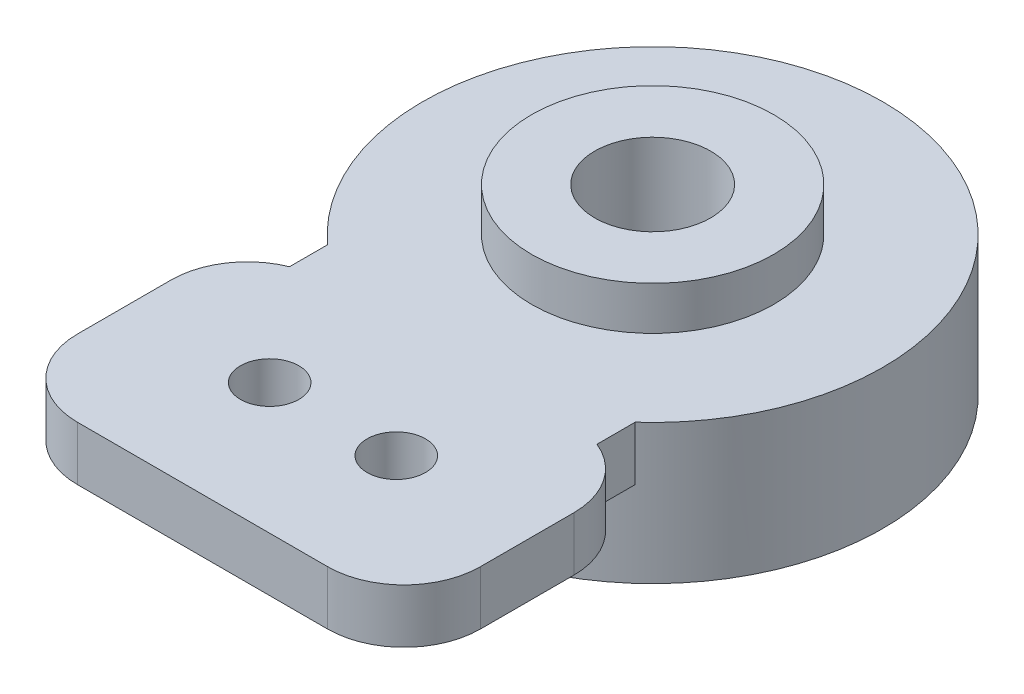
ISO-10303-21;
HEADER;
FILE_DESCRIPTION(('STEP AP214'),'2;1');
FILE_NAME('part.step','',(''),(''),'','','');
FILE_SCHEMA(('AUTOMOTIVE_DESIGN { 1 0 10303 214 1 1 1 1 }'));
ENDSEC;
DATA;
#1=APPLICATION_CONTEXT('core data for automotive mechanical design processes');
#2=APPLICATION_PROTOCOL_DEFINITION('international standard','automotive_design',2000,#1);
#3=PRODUCT_CONTEXT('',#1,'mechanical');
#4=PRODUCT('Part','Part','',(#3));
#5=PRODUCT_RELATED_PRODUCT_CATEGORY('part','',(#4));
#6=PRODUCT_DEFINITION_FORMATION('','',#4);
#7=PRODUCT_DEFINITION_CONTEXT('part definition',#1,'design');
#8=PRODUCT_DEFINITION('design','',#6,#7);
#9=PRODUCT_DEFINITION_SHAPE('','',#8);
#10=(LENGTH_UNIT() NAMED_UNIT(*) SI_UNIT(.MILLI.,.METRE.));
#11=(NAMED_UNIT(*) PLANE_ANGLE_UNIT() SI_UNIT($,.RADIAN.));
#12=(NAMED_UNIT(*) SI_UNIT($,.STERADIAN.) SOLID_ANGLE_UNIT());
#13=UNCERTAINTY_MEASURE_WITH_UNIT(LENGTH_MEASURE(1.E-05),#10,'distance_accuracy_value','');
#14=(GEOMETRIC_REPRESENTATION_CONTEXT(3) GLOBAL_UNCERTAINTY_ASSIGNED_CONTEXT((#13)) GLOBAL_UNIT_ASSIGNED_CONTEXT((#10,
#11,#12)) REPRESENTATION_CONTEXT('',''));
#15=CARTESIAN_POINT('',(0.,0.,0.));
#16=DIRECTION('',(0.,0.,1.));
#17=DIRECTION('',(1.,0.,0.));
#18=AXIS2_PLACEMENT_3D('',#15,#16,#17);
#19=CARTESIAN_POINT('',(6.55,2.83,14.6747039521318));
#20=DIRECTION('',(0.,-1.,0.));
#21=DIRECTION('',(0.,0.,-1.));
#22=AXIS2_PLACEMENT_3D('',#19,#20,#21);
#23=CYLINDRICAL_SURFACE('',#22,4.);
#24=CARTESIAN_POINT('',(6.55,0.,14.6747039521318));
#25=DIRECTION('',(0.,1.,0.));
#26=DIRECTION('',(0.,0.,-1.));
#27=AXIS2_PLACEMENT_3D('',#24,#25,#26);
#28=CIRCLE('',#27,4.);
#29=CARTESIAN_POINT('',(10.55,0.,14.6747039521318));
#30=VERTEX_POINT('',#29);
#31=CARTESIAN_POINT('',(8.05,0.,10.966604708584));
#32=VERTEX_POINT('',#31);
#33=EDGE_CURVE('E145',#30,#32,#28,.T.);
#34=ORIENTED_EDGE('',*,*,#33,.T.);
#35=DIRECTION('',(0.,-1.,0.));
#36=VECTOR('',#35,1.);
#37=CARTESIAN_POINT('',(8.05,2.83,10.966604708584));
#38=LINE('',#37,#36);
#39=CARTESIAN_POINT('',(8.05,2.83,10.966604708584));
#40=VERTEX_POINT('',#39);
#41=EDGE_CURVE('E44',#40,#32,#38,.T.);
#42=ORIENTED_EDGE('',*,*,#41,.F.);
#43=CARTESIAN_POINT('',(6.55,2.83,14.6747039521318));
#44=DIRECTION('',(0.,1.,0.));
#45=DIRECTION('',(0.,0.,-1.));
#46=AXIS2_PLACEMENT_3D('',#43,#44,#45);
#47=CIRCLE('',#46,4.);
#48=CARTESIAN_POINT('',(10.55,2.83,14.6747039521318));
#49=VERTEX_POINT('',#48);
#50=EDGE_CURVE('E163',#49,#40,#47,.T.);
#51=ORIENTED_EDGE('',*,*,#50,.F.);
#52=DIRECTION('',(0.,-1.,0.));
#53=VECTOR('',#52,1.);
#54=CARTESIAN_POINT('',(10.55,2.83,14.6747039521318));
#55=LINE('',#54,#53);
#56=EDGE_CURVE('E141',#49,#30,#55,.T.);
#57=ORIENTED_EDGE('',*,*,#56,.T.);
#58=EDGE_LOOP('',(#34,#42,#51,#57));
#59=FACE_BOUND('',#58,.T.);
#60=ADVANCED_FACE('F35',(#59),#23,.T.);
#61=CARTESIAN_POINT('',(8.05,2.83,8.96660470858396));
#62=DIRECTION('',(-1.,0.,0.));
#63=DIRECTION('',(0.,0.,1.));
#64=AXIS2_PLACEMENT_3D('',#61,#62,#63);
#65=PLANE('',#64);
#66=DIRECTION('',(0.,0.,-1.));
#67=VECTOR('',#66,1.);
#68=CARTESIAN_POINT('',(8.05,0.,8.96660470858396));
#69=LINE('',#68,#67);
#70=CARTESIAN_POINT('',(8.05,0.,8.96660470858396));
#71=VERTEX_POINT('',#70);
#72=EDGE_CURVE('E148',#32,#71,#69,.T.);
#73=ORIENTED_EDGE('',*,*,#72,.T.);
#74=DIRECTION('',(0.,-1.,0.));
#75=VECTOR('',#74,1.);
#76=CARTESIAN_POINT('',(8.05,2.83,8.96660470858396));
#77=LINE('',#76,#75);
#78=CARTESIAN_POINT('',(8.05,2.83,8.96660470858396));
#79=VERTEX_POINT('',#78);
#80=EDGE_CURVE('E179',#79,#71,#77,.T.);
#81=ORIENTED_EDGE('',*,*,#80,.F.);
#82=DIRECTION('',(0.,0.,-1.));
#83=VECTOR('',#82,1.);
#84=CARTESIAN_POINT('',(8.05,2.83,8.96660470858396));
#85=LINE('',#84,#83);
#86=EDGE_CURVE('E101',#40,#79,#85,.T.);
#87=ORIENTED_EDGE('',*,*,#86,.F.);
#88=ORIENTED_EDGE('',*,*,#41,.T.);
#89=EDGE_LOOP('',(#73,#81,#87,#88));
#90=FACE_BOUND('',#89,.T.);
#91=ADVANCED_FACE('F246',(#90),#65,.F.);
#92=CARTESIAN_POINT('',(0.,2.83,0.));
#93=DIRECTION('',(0.,-1.,0.));
#94=DIRECTION('',(0.,0.,-1.));
#95=AXIS2_PLACEMENT_3D('',#92,#93,#94);
#96=CYLINDRICAL_SURFACE('',#95,12.05);
#97=ORIENTED_EDGE('',*,*,#80,.T.);
#98=CARTESIAN_POINT('',(0.,0.,0.));
#99=DIRECTION('',(0.,-1.,0.));
#100=DIRECTION('',(0.,0.,-1.));
#101=AXIS2_PLACEMENT_3D('',#98,#99,#100);
#102=CIRCLE('',#101,12.05);
#103=CARTESIAN_POINT('',(-8.05,0.,8.96660470858395));
#104=VERTEX_POINT('',#103);
#105=EDGE_CURVE('E204',#71,#104,#102,.T.);
#106=ORIENTED_EDGE('',*,*,#105,.T.);
#107=DIRECTION('',(0.,-1.,0.));
#108=VECTOR('',#107,1.);
#109=CARTESIAN_POINT('',(-8.05,2.83,8.96660470858395));
#110=LINE('',#109,#108);
#111=CARTESIAN_POINT('',(-8.05,2.83,8.96660470858395));
#112=VERTEX_POINT('',#111);
#113=EDGE_CURVE('E176',#112,#104,#110,.T.);
#114=ORIENTED_EDGE('',*,*,#113,.F.);
#115=CARTESIAN_POINT('',(0.,2.83,0.));
#116=DIRECTION('',(0.,1.,0.));
#117=DIRECTION('',(0.,0.,1.));
#118=AXIS2_PLACEMENT_3D('',#115,#116,#117);
#119=CIRCLE('',#118,12.05);
#120=EDGE_CURVE('E210',#79,#112,#119,.T.);
#121=ORIENTED_EDGE('',*,*,#120,.F.);
#122=EDGE_LOOP('',(#97,#106,#114,#121));
#123=FACE_BOUND('',#122,.T.);
#124=CARTESIAN_POINT('',(0.,-4.48,0.));
#125=DIRECTION('',(0.,-1.,0.));
#126=DIRECTION('',(0.,0.,-1.));
#127=AXIS2_PLACEMENT_3D('',#124,#125,#126);
#128=CIRCLE('',#127,12.05);
#129=CARTESIAN_POINT('',(0.,-4.48,-12.05));
#130=VERTEX_POINT('',#129);
#131=EDGE_CURVE('E149',#130,#130,#128,.T.);
#132=ORIENTED_EDGE('',*,*,#131,.F.);
#133=EDGE_LOOP('',(#132));
#134=FACE_BOUND('',#133,.T.);
#135=ADVANCED_FACE('F250',(#123,#134),#96,.T.);
#136=CARTESIAN_POINT('',(-8.05,2.83,8.96660470858395));
#137=DIRECTION('',(1.,0.,0.));
#138=DIRECTION('',(0.,0.,-1.));
#139=AXIS2_PLACEMENT_3D('',#136,#137,#138);
#140=PLANE('',#139);
#141=DIRECTION('',(0.,0.,1.));
#142=VECTOR('',#141,1.);
#143=CARTESIAN_POINT('',(-8.05,0.,8.96660470858395));
#144=LINE('',#143,#142);
#145=CARTESIAN_POINT('',(-8.05,0.,10.966604708584));
#146=VERTEX_POINT('',#145);
#147=EDGE_CURVE('E152',#104,#146,#144,.T.);
#148=ORIENTED_EDGE('',*,*,#147,.T.);
#149=DIRECTION('',(0.,-1.,0.));
#150=VECTOR('',#149,1.);
#151=CARTESIAN_POINT('',(-8.05,2.83,10.966604708584));
#152=LINE('',#151,#150);
#153=CARTESIAN_POINT('',(-8.05,2.83,10.966604708584));
#154=VERTEX_POINT('',#153);
#155=EDGE_CURVE('E173',#154,#146,#152,.T.);
#156=ORIENTED_EDGE('',*,*,#155,.F.);
#157=DIRECTION('',(0.,0.,1.));
#158=VECTOR('',#157,1.);
#159=CARTESIAN_POINT('',(-8.05,2.83,8.96660470858395));
#160=LINE('',#159,#158);
#161=EDGE_CURVE('E212',#112,#154,#160,.T.);
#162=ORIENTED_EDGE('',*,*,#161,.F.);
#163=ORIENTED_EDGE('',*,*,#113,.T.);
#164=EDGE_LOOP('',(#148,#156,#162,#163));
#165=FACE_BOUND('',#164,.T.);
#166=ADVANCED_FACE('F254',(#165),#140,.F.);
#167=CARTESIAN_POINT('',(-6.55,2.83,14.6747039521318));
#168=DIRECTION('',(0.,-1.,0.));
#169=DIRECTION('',(0.,0.,-1.));
#170=AXIS2_PLACEMENT_3D('',#167,#168,#169);
#171=CYLINDRICAL_SURFACE('',#170,4.);
#172=CARTESIAN_POINT('',(-6.55,0.,14.6747039521318));
#173=DIRECTION('',(0.,1.,0.));
#174=DIRECTION('',(0.,0.,-1.));
#175=AXIS2_PLACEMENT_3D('',#172,#173,#174);
#176=CIRCLE('',#175,4.);
#177=CARTESIAN_POINT('',(-10.55,0.,14.6747039521318));
#178=VERTEX_POINT('',#177);
#179=EDGE_CURVE('E154',#146,#178,#176,.T.);
#180=ORIENTED_EDGE('',*,*,#179,.T.);
#181=DIRECTION('',(0.,-1.,0.));
#182=VECTOR('',#181,1.);
#183=CARTESIAN_POINT('',(-10.55,2.83,14.6747039521318));
#184=LINE('',#183,#182);
#185=CARTESIAN_POINT('',(-10.55,2.83,14.6747039521318));
#186=VERTEX_POINT('',#185);
#187=EDGE_CURVE('E170',#186,#178,#184,.T.);
#188=ORIENTED_EDGE('',*,*,#187,.F.);
#189=CARTESIAN_POINT('',(-6.55,2.83,14.6747039521318));
#190=DIRECTION('',(0.,1.,0.));
#191=DIRECTION('',(0.,0.,-1.));
#192=AXIS2_PLACEMENT_3D('',#189,#190,#191);
#193=CIRCLE('',#192,4.);
#194=EDGE_CURVE('E214',#154,#186,#193,.T.);
#195=ORIENTED_EDGE('',*,*,#194,.F.);
#196=ORIENTED_EDGE('',*,*,#155,.T.);
#197=EDGE_LOOP('',(#180,#188,#195,#196));
#198=FACE_BOUND('',#197,.T.);
#199=ADVANCED_FACE('F260',(#198),#171,.T.);
#200=CARTESIAN_POINT('',(-10.55,2.83,19.57));
#201=DIRECTION('',(1.,0.,0.));
#202=DIRECTION('',(0.,0.,-1.));
#203=AXIS2_PLACEMENT_3D('',#200,#201,#202);
#204=PLANE('',#203);
#205=DIRECTION('',(0.,0.,1.));
#206=VECTOR('',#205,1.);
#207=CARTESIAN_POINT('',(-10.55,0.,19.57));
#208=LINE('',#207,#206);
#209=CARTESIAN_POINT('',(-10.55,0.,19.57));
#210=VERTEX_POINT('',#209);
#211=EDGE_CURVE('E156',#178,#210,#208,.T.);
#212=ORIENTED_EDGE('',*,*,#211,.T.);
#213=DIRECTION('',(0.,-1.,0.));
#214=VECTOR('',#213,1.);
#215=CARTESIAN_POINT('',(-10.55,2.83,19.57));
#216=LINE('',#215,#214);
#217=CARTESIAN_POINT('',(-10.55,2.83,19.57));
#218=VERTEX_POINT('',#217);
#219=EDGE_CURVE('E167',#218,#210,#216,.T.);
#220=ORIENTED_EDGE('',*,*,#219,.F.);
#221=DIRECTION('',(0.,0.,1.));
#222=VECTOR('',#221,1.);
#223=CARTESIAN_POINT('',(-10.55,2.83,19.57));
#224=LINE('',#223,#222);
#225=EDGE_CURVE('E216',#186,#218,#224,.T.);
#226=ORIENTED_EDGE('',*,*,#225,.F.);
#227=ORIENTED_EDGE('',*,*,#187,.T.);
#228=EDGE_LOOP('',(#212,#220,#226,#227));
#229=FACE_BOUND('',#228,.T.);
#230=ADVANCED_FACE('F222',(#229),#204,.F.);
#231=CARTESIAN_POINT('',(-6.55,2.83,19.57));
#232=DIRECTION('',(0.,-1.,0.));
#233=DIRECTION('',(0.,0.,-1.));
#234=AXIS2_PLACEMENT_3D('',#231,#232,#233);
#235=CYLINDRICAL_SURFACE('',#234,4.);
#236=CARTESIAN_POINT('',(-6.55,0.,19.57));
#237=DIRECTION('',(0.,1.,0.));
#238=DIRECTION('',(0.,0.,-1.));
#239=AXIS2_PLACEMENT_3D('',#236,#237,#238);
#240=CIRCLE('',#239,4.);
#241=CARTESIAN_POINT('',(-6.55,0.,23.57));
#242=VERTEX_POINT('',#241);
#243=EDGE_CURVE('E158',#210,#242,#240,.T.);
#244=ORIENTED_EDGE('',*,*,#243,.T.);
#245=DIRECTION('',(0.,-1.,0.));
#246=VECTOR('',#245,1.);
#247=CARTESIAN_POINT('',(-6.55,2.83,23.57));
#248=LINE('',#247,#246);
#249=CARTESIAN_POINT('',(-6.55,2.83,23.57));
#250=VERTEX_POINT('',#249);
#251=EDGE_CURVE('E136',#250,#242,#248,.T.);
#252=ORIENTED_EDGE('',*,*,#251,.F.);
#253=CARTESIAN_POINT('',(-6.55,2.83,19.57));
#254=DIRECTION('',(0.,1.,0.));
#255=DIRECTION('',(0.,0.,-1.));
#256=AXIS2_PLACEMENT_3D('',#253,#254,#255);
#257=CIRCLE('',#256,4.);
#258=EDGE_CURVE('E127',#218,#250,#257,.T.);
#259=ORIENTED_EDGE('',*,*,#258,.F.);
#260=ORIENTED_EDGE('',*,*,#219,.T.);
#261=EDGE_LOOP('',(#244,#252,#259,#260));
#262=FACE_BOUND('',#261,.T.);
#263=ADVANCED_FACE('F226',(#262),#235,.T.);
#264=CARTESIAN_POINT('',(-6.55,2.83,23.57));
#265=DIRECTION('',(0.,0.,-1.));
#266=DIRECTION('',(-1.,0.,0.));
#267=AXIS2_PLACEMENT_3D('',#264,#265,#266);
#268=PLANE('',#267);
#269=DIRECTION('',(1.,0.,0.));
#270=VECTOR('',#269,1.);
#271=CARTESIAN_POINT('',(-6.55,0.,23.57));
#272=LINE('',#271,#270);
#273=CARTESIAN_POINT('',(6.55,0.,23.57));
#274=VERTEX_POINT('',#273);
#275=EDGE_CURVE('E135',#242,#274,#272,.T.);
#276=ORIENTED_EDGE('',*,*,#275,.T.);
#277=DIRECTION('',(0.,-1.,0.));
#278=VECTOR('',#277,1.);
#279=CARTESIAN_POINT('',(6.55,2.83,23.57));
#280=LINE('',#279,#278);
#281=CARTESIAN_POINT('',(6.55,2.83,23.57));
#282=VERTEX_POINT('',#281);
#283=EDGE_CURVE('E132',#282,#274,#280,.T.);
#284=ORIENTED_EDGE('',*,*,#283,.F.);
#285=DIRECTION('',(1.,0.,0.));
#286=VECTOR('',#285,1.);
#287=CARTESIAN_POINT('',(-6.55,2.83,23.57));
#288=LINE('',#287,#286);
#289=EDGE_CURVE('E121',#250,#282,#288,.T.);
#290=ORIENTED_EDGE('',*,*,#289,.F.);
#291=ORIENTED_EDGE('',*,*,#251,.T.);
#292=EDGE_LOOP('',(#276,#284,#290,#291));
#293=FACE_BOUND('',#292,.T.);
#294=ADVANCED_FACE('F133',(#293),#268,.F.);
#295=CARTESIAN_POINT('',(6.55,2.83,19.57));
#296=DIRECTION('',(0.,-1.,0.));
#297=DIRECTION('',(0.,0.,-1.));
#298=AXIS2_PLACEMENT_3D('',#295,#296,#297);
#299=CYLINDRICAL_SURFACE('',#298,4.);
#300=CARTESIAN_POINT('',(6.55,0.,19.57));
#301=DIRECTION('',(0.,1.,0.));
#302=DIRECTION('',(0.,0.,1.));
#303=AXIS2_PLACEMENT_3D('',#300,#301,#302);
#304=CIRCLE('',#303,4.);
#305=CARTESIAN_POINT('',(10.55,0.,19.57));
#306=VERTEX_POINT('',#305);
#307=EDGE_CURVE('E86',#274,#306,#304,.T.);
#308=ORIENTED_EDGE('',*,*,#307,.T.);
#309=DIRECTION('',(0.,-1.,0.));
#310=VECTOR('',#309,1.);
#311=CARTESIAN_POINT('',(10.55,2.83,19.57));
#312=LINE('',#311,#310);
#313=CARTESIAN_POINT('',(10.55,2.83,19.57));
#314=VERTEX_POINT('',#313);
#315=EDGE_CURVE('E137',#314,#306,#312,.T.);
#316=ORIENTED_EDGE('',*,*,#315,.F.);
#317=CARTESIAN_POINT('',(6.55,2.83,19.57));
#318=DIRECTION('',(0.,1.,0.));
#319=DIRECTION('',(0.,0.,1.));
#320=AXIS2_PLACEMENT_3D('',#317,#318,#319);
#321=CIRCLE('',#320,4.);
#322=EDGE_CURVE('E125',#282,#314,#321,.T.);
#323=ORIENTED_EDGE('',*,*,#322,.F.);
#324=ORIENTED_EDGE('',*,*,#283,.T.);
#325=EDGE_LOOP('',(#308,#316,#323,#324));
#326=FACE_BOUND('',#325,.T.);
#327=ADVANCED_FACE('F139',(#326),#299,.T.);
#328=CARTESIAN_POINT('',(10.55,2.83,19.57));
#329=DIRECTION('',(-1.,0.,0.));
#330=DIRECTION('',(0.,0.,1.));
#331=AXIS2_PLACEMENT_3D('',#328,#329,#330);
#332=PLANE('',#331);
#333=DIRECTION('',(0.,0.,-1.));
#334=VECTOR('',#333,1.);
#335=CARTESIAN_POINT('',(10.55,0.,19.57));
#336=LINE('',#335,#334);
#337=EDGE_CURVE('E92',#306,#30,#336,.T.);
#338=ORIENTED_EDGE('',*,*,#337,.T.);
#339=ORIENTED_EDGE('',*,*,#56,.F.);
#340=DIRECTION('',(0.,0.,-1.));
#341=VECTOR('',#340,1.);
#342=CARTESIAN_POINT('',(10.55,2.83,19.57));
#343=LINE('',#342,#341);
#344=EDGE_CURVE('E53',#314,#49,#343,.T.);
#345=ORIENTED_EDGE('',*,*,#344,.F.);
#346=ORIENTED_EDGE('',*,*,#315,.T.);
#347=EDGE_LOOP('',(#338,#339,#345,#346));
#348=FACE_BOUND('',#347,.T.);
#349=ADVANCED_FACE('F234',(#348),#332,.F.);
#350=CARTESIAN_POINT('',(6.55,2.83,14.6747039521318));
#351=DIRECTION('',(0.,-1.,0.));
#352=DIRECTION('',(0.,0.,-1.));
#353=AXIS2_PLACEMENT_3D('',#350,#351,#352);
#354=PLANE('',#353);
#355=CARTESIAN_POINT('',(3.315,2.83,16.74));
#356=DIRECTION('',(0.,1.,0.));
#357=DIRECTION('',(0.,0.,1.));
#358=AXIS2_PLACEMENT_3D('',#355,#356,#357);
#359=CIRCLE('',#358,1.53);
#360=CARTESIAN_POINT('',(3.315,2.83,18.27));
#361=VERTEX_POINT('',#360);
#362=EDGE_CURVE('E196',#361,#361,#359,.T.);
#363=ORIENTED_EDGE('',*,*,#362,.F.);
#364=EDGE_LOOP('',(#363));
#365=FACE_BOUND('',#364,.T.);
#366=CARTESIAN_POINT('',(-3.315,2.83,16.74));
#367=DIRECTION('',(0.,1.,0.));
#368=DIRECTION('',(0.,0.,1.));
#369=AXIS2_PLACEMENT_3D('',#366,#367,#368);
#370=CIRCLE('',#369,1.53);
#371=CARTESIAN_POINT('',(-3.315,2.83,18.27));
#372=VERTEX_POINT('',#371);
#373=EDGE_CURVE('E185',#372,#372,#370,.T.);
#374=ORIENTED_EDGE('',*,*,#373,.F.);
#375=EDGE_LOOP('',(#374));
#376=FACE_BOUND('',#375,.T.);
#377=CARTESIAN_POINT('',(0.,2.83,0.));
#378=DIRECTION('',(0.,-1.,0.));
#379=DIRECTION('',(0.,0.,-1.));
#380=AXIS2_PLACEMENT_3D('',#377,#378,#379);
#381=CIRCLE('',#380,6.34);
#382=CARTESIAN_POINT('',(0.,2.83,-6.34));
#383=VERTEX_POINT('',#382);
#384=EDGE_CURVE('E11',#383,#383,#381,.F.);
#385=ORIENTED_EDGE('',*,*,#384,.F.);
#386=EDGE_LOOP('',(#385));
#387=FACE_BOUND('',#386,.T.);
#388=ORIENTED_EDGE('',*,*,#50,.T.);
#389=ORIENTED_EDGE('',*,*,#86,.T.);
#390=ORIENTED_EDGE('',*,*,#120,.T.);
#391=ORIENTED_EDGE('',*,*,#161,.T.);
#392=ORIENTED_EDGE('',*,*,#194,.T.);
#393=ORIENTED_EDGE('',*,*,#225,.T.);
#394=ORIENTED_EDGE('',*,*,#258,.T.);
#395=ORIENTED_EDGE('',*,*,#289,.T.);
#396=ORIENTED_EDGE('',*,*,#322,.T.);
#397=ORIENTED_EDGE('',*,*,#344,.T.);
#398=EDGE_LOOP('',(#388,#389,#390,#391,#392,#393,#394,#395,#396,#397));
#399=FACE_BOUND('',#398,.T.);
#400=ADVANCED_FACE('F123',(#365,#376,#387,#399),#354,.F.);
#401=CARTESIAN_POINT('',(6.55,0.,14.6747039521318));
#402=DIRECTION('',(0.,-1.,0.));
#403=DIRECTION('',(0.,0.,-1.));
#404=AXIS2_PLACEMENT_3D('',#401,#402,#403);
#405=PLANE('',#404);
#406=CARTESIAN_POINT('',(3.315,0.,16.74));
#407=DIRECTION('',(0.,-1.,0.));
#408=DIRECTION('',(0.,0.,-1.));
#409=AXIS2_PLACEMENT_3D('',#406,#407,#408);
#410=CIRCLE('',#409,1.53);
#411=CARTESIAN_POINT('',(3.315,0.,18.27));
#412=VERTEX_POINT('',#411);
#413=EDGE_CURVE('E38',#412,#412,#410,.T.);
#414=ORIENTED_EDGE('',*,*,#413,.F.);
#415=EDGE_LOOP('',(#414));
#416=FACE_BOUND('',#415,.T.);
#417=CARTESIAN_POINT('',(-3.315,0.,16.74));
#418=DIRECTION('',(0.,-1.,0.));
#419=DIRECTION('',(0.,0.,-1.));
#420=AXIS2_PLACEMENT_3D('',#417,#418,#419);
#421=CIRCLE('',#420,1.53);
#422=CARTESIAN_POINT('',(-3.315,0.,18.27));
#423=VERTEX_POINT('',#422);
#424=EDGE_CURVE('E182',#423,#423,#421,.T.);
#425=ORIENTED_EDGE('',*,*,#424,.F.);
#426=EDGE_LOOP('',(#425));
#427=FACE_BOUND('',#426,.T.);
#428=ORIENTED_EDGE('',*,*,#105,.F.);
#429=ORIENTED_EDGE('',*,*,#72,.F.);
#430=ORIENTED_EDGE('',*,*,#33,.F.);
#431=ORIENTED_EDGE('',*,*,#337,.F.);
#432=ORIENTED_EDGE('',*,*,#307,.F.);
#433=ORIENTED_EDGE('',*,*,#275,.F.);
#434=ORIENTED_EDGE('',*,*,#243,.F.);
#435=ORIENTED_EDGE('',*,*,#211,.F.);
#436=ORIENTED_EDGE('',*,*,#179,.F.);
#437=ORIENTED_EDGE('',*,*,#147,.F.);
#438=EDGE_LOOP('',(#428,#429,#430,#431,#432,#433,#434,#435,#436,#437));
#439=FACE_BOUND('',#438,.T.);
#440=ADVANCED_FACE('F229',(#416,#427,#439),#405,.T.);
#441=CARTESIAN_POINT('',(0.,-4.48,0.));
#442=DIRECTION('',(0.,-1.,0.));
#443=DIRECTION('',(0.,0.,-1.));
#444=AXIS2_PLACEMENT_3D('',#441,#442,#443);
#445=PLANE('',#444);
#446=CARTESIAN_POINT('',(0.,-4.48,0.));
#447=DIRECTION('',(0.,1.,0.));
#448=DIRECTION('',(0.,0.,1.));
#449=AXIS2_PLACEMENT_3D('',#446,#447,#448);
#450=CIRCLE('',#449,3.035);
#451=CARTESIAN_POINT('',(0.,-4.48,3.035));
#452=VERTEX_POINT('',#451);
#453=EDGE_CURVE('E189',#452,#452,#450,.T.);
#454=ORIENTED_EDGE('',*,*,#453,.T.);
#455=EDGE_LOOP('',(#454));
#456=FACE_BOUND('',#455,.T.);
#457=ORIENTED_EDGE('',*,*,#131,.T.);
#458=EDGE_LOOP('',(#457));
#459=FACE_BOUND('',#458,.T.);
#460=ADVANCED_FACE('F315',(#456,#459),#445,.T.);
#461=CARTESIAN_POINT('',(0.,5.1,0.));
#462=DIRECTION('',(0.,-1.,0.));
#463=DIRECTION('',(0.,0.,-1.));
#464=AXIS2_PLACEMENT_3D('',#461,#462,#463);
#465=CYLINDRICAL_SURFACE('',#464,6.34);
#466=CARTESIAN_POINT('',(0.,5.1,0.));
#467=DIRECTION('',(0.,1.,0.));
#468=DIRECTION('',(0.,0.,1.));
#469=AXIS2_PLACEMENT_3D('',#466,#467,#468);
#470=CIRCLE('',#469,6.34);
#471=CARTESIAN_POINT('',(0.,5.1,6.34));
#472=VERTEX_POINT('',#471);
#473=EDGE_CURVE('E200',#472,#472,#470,.T.);
#474=ORIENTED_EDGE('',*,*,#473,.F.);
#475=EDGE_LOOP('',(#474));
#476=FACE_BOUND('',#475,.T.);
#477=ORIENTED_EDGE('',*,*,#384,.T.);
#478=EDGE_LOOP('',(#477));
#479=FACE_BOUND('',#478,.T.);
#480=ADVANCED_FACE('F309',(#476,#479),#465,.T.);
#481=CARTESIAN_POINT('',(0.,5.1,0.));
#482=DIRECTION('',(0.,1.,0.));
#483=DIRECTION('',(0.,0.,1.));
#484=AXIS2_PLACEMENT_3D('',#481,#482,#483);
#485=PLANE('',#484);
#486=CARTESIAN_POINT('',(0.,5.1,0.));
#487=DIRECTION('',(0.,1.,0.));
#488=DIRECTION('',(0.,0.,1.));
#489=AXIS2_PLACEMENT_3D('',#486,#487,#488);
#490=CIRCLE('',#489,3.035);
#491=CARTESIAN_POINT('',(0.,5.1,3.035));
#492=VERTEX_POINT('',#491);
#493=EDGE_CURVE('E184',#492,#492,#490,.T.);
#494=ORIENTED_EDGE('',*,*,#493,.F.);
#495=EDGE_LOOP('',(#494));
#496=FACE_BOUND('',#495,.T.);
#497=ORIENTED_EDGE('',*,*,#473,.T.);
#498=EDGE_LOOP('',(#497));
#499=FACE_BOUND('',#498,.T.);
#500=ADVANCED_FACE('F314',(#496,#499),#485,.T.);
#501=CARTESIAN_POINT('',(0.,-4.48,0.));
#502=DIRECTION('',(0.,1.,0.));
#503=DIRECTION('',(0.,0.,1.));
#504=AXIS2_PLACEMENT_3D('',#501,#502,#503);
#505=CYLINDRICAL_SURFACE('',#504,3.035);
#506=ORIENTED_EDGE('',*,*,#453,.F.);
#507=EDGE_LOOP('',(#506));
#508=FACE_BOUND('',#507,.T.);
#509=ORIENTED_EDGE('',*,*,#493,.T.);
#510=EDGE_LOOP('',(#509));
#511=FACE_BOUND('',#510,.T.);
#512=ADVANCED_FACE('F334',(#508,#511),#505,.F.);
#513=CARTESIAN_POINT('',(-3.315,-4.48,16.74));
#514=DIRECTION('',(0.,1.,0.));
#515=DIRECTION('',(0.,0.,1.));
#516=AXIS2_PLACEMENT_3D('',#513,#514,#515);
#517=CYLINDRICAL_SURFACE('',#516,1.53);
#518=CARTESIAN_POINT('',(-3.315,0.,18.27));
#519=CARTESIAN_POINT('',(-3.315,0.0294791666666676,18.27));
#520=CARTESIAN_POINT('',(-3.315,0.0589583333333342,18.27));
#521=CARTESIAN_POINT('',(-3.315,0.117916666666668,18.27));
#522=CARTESIAN_POINT('',(-3.315,0.147395833333334,18.27));
#523=CARTESIAN_POINT('',(-3.315,0.206354166666667,18.27));
#524=CARTESIAN_POINT('',(-3.315,0.235833333333334,18.27));
#525=CARTESIAN_POINT('',(-3.315,0.294791666666667,18.27));
#526=CARTESIAN_POINT('',(-3.315,0.324270833333334,18.27));
#527=CARTESIAN_POINT('',(-3.315,0.383229166666667,18.27));
#528=CARTESIAN_POINT('',(-3.315,0.412708333333334,18.27));
#529=CARTESIAN_POINT('',(-3.315,0.471666666666667,18.27));
#530=CARTESIAN_POINT('',(-3.315,0.501145833333334,18.27));
#531=CARTESIAN_POINT('',(-3.315,0.560104166666667,18.27));
#532=CARTESIAN_POINT('',(-3.315,0.589583333333334,18.27));
#533=CARTESIAN_POINT('',(-3.315,0.648541666666667,18.27));
#534=CARTESIAN_POINT('',(-3.315,0.678020833333334,18.27));
#535=CARTESIAN_POINT('',(-3.315,0.736979166666667,18.27));
#536=CARTESIAN_POINT('',(-3.315,0.766458333333334,18.27));
#537=CARTESIAN_POINT('',(-3.315,0.825416666666667,18.27));
#538=CARTESIAN_POINT('',(-3.315,0.854895833333334,18.27));
#539=CARTESIAN_POINT('',(-3.315,0.913854166666667,18.27));
#540=CARTESIAN_POINT('',(-3.315,0.943333333333334,18.27));
#541=CARTESIAN_POINT('',(-3.315,1.00229166666667,18.27));
#542=CARTESIAN_POINT('',(-3.315,1.03177083333333,18.27));
#543=CARTESIAN_POINT('',(-3.315,1.09072916666667,18.27));
#544=CARTESIAN_POINT('',(-3.315,1.12020833333333,18.27));
#545=CARTESIAN_POINT('',(-3.315,1.17916666666667,18.27));
#546=CARTESIAN_POINT('',(-3.315,1.20864583333333,18.27));
#547=CARTESIAN_POINT('',(-3.315,1.26760416666667,18.27));
#548=CARTESIAN_POINT('',(-3.315,1.29708333333333,18.27));
#549=CARTESIAN_POINT('',(-3.315,1.35604166666667,18.27));
#550=CARTESIAN_POINT('',(-3.315,1.38552083333333,18.27));
#551=CARTESIAN_POINT('',(-3.315,1.44447916666667,18.27));
#552=CARTESIAN_POINT('',(-3.315,1.47395833333333,18.27));
#553=CARTESIAN_POINT('',(-3.315,1.53291666666667,18.27));
#554=CARTESIAN_POINT('',(-3.315,1.56239583333333,18.27));
#555=CARTESIAN_POINT('',(-3.315,1.62135416666667,18.27));
#556=CARTESIAN_POINT('',(-3.315,1.65083333333333,18.27));
#557=CARTESIAN_POINT('',(-3.315,1.70979166666667,18.27));
#558=CARTESIAN_POINT('',(-3.315,1.73927083333333,18.27));
#559=CARTESIAN_POINT('',(-3.315,1.79822916666667,18.27));
#560=CARTESIAN_POINT('',(-3.315,1.82770833333333,18.27));
#561=CARTESIAN_POINT('',(-3.315,1.88666666666667,18.27));
#562=CARTESIAN_POINT('',(-3.315,1.91614583333333,18.27));
#563=CARTESIAN_POINT('',(-3.315,1.97510416666667,18.27));
#564=CARTESIAN_POINT('',(-3.315,2.00458333333333,18.27));
#565=CARTESIAN_POINT('',(-3.315,2.06354166666667,18.27));
#566=CARTESIAN_POINT('',(-3.315,2.09302083333333,18.27));
#567=CARTESIAN_POINT('',(-3.315,2.15197916666667,18.27));
#568=CARTESIAN_POINT('',(-3.315,2.18145833333333,18.27));
#569=CARTESIAN_POINT('',(-3.315,2.24041666666667,18.27));
#570=CARTESIAN_POINT('',(-3.315,2.26989583333333,18.27));
#571=CARTESIAN_POINT('',(-3.315,2.32885416666667,18.27));
#572=CARTESIAN_POINT('',(-3.315,2.35833333333333,18.27));
#573=CARTESIAN_POINT('',(-3.315,2.41729166666667,18.27));
#574=CARTESIAN_POINT('',(-3.315,2.44677083333333,18.27));
#575=CARTESIAN_POINT('',(-3.315,2.50572916666667,18.27));
#576=CARTESIAN_POINT('',(-3.315,2.53520833333333,18.27));
#577=CARTESIAN_POINT('',(-3.315,2.59416666666667,18.27));
#578=CARTESIAN_POINT('',(-3.315,2.62364583333333,18.27));
#579=CARTESIAN_POINT('',(-3.315,2.68260416666667,18.27));
#580=CARTESIAN_POINT('',(-3.315,2.71208333333333,18.27));
#581=CARTESIAN_POINT('',(-3.315,2.77104166666667,18.27));
#582=CARTESIAN_POINT('',(-3.315,2.80052083333333,18.27));
#583=CARTESIAN_POINT('',(-3.315,2.83,18.27));
#584=B_SPLINE_CURVE_WITH_KNOTS('',3,(#518,#519,#520,#521,#522,#523,#524,#525,#526,#527,#528,
#529,#530,#531,#532,#533,#534,#535,#536,#537,#538,#539,#540,#541,#542,#543,#544,#545,#546,#547,
#548,#549,#550,#551,#552,#553,#554,#555,#556,#557,#558,#559,#560,#561,#562,#563,#564,#565,#566,
#567,#568,#569,#570,#571,#572,#573,#574,#575,#576,#577,#578,#579,#580,#581,#582,#583),
.UNSPECIFIED.,.F.,.F.,(4,2,2,2,2,2,2,2,2,2,2,2,2,2,2,2,2,2,2,2,2,2,2,2,2,2,2,2,2,2,2,2,4),(0.,
0.0884375,0.176875,0.2653125,0.35375,0.4421875,0.530625,0.6190625,0.7075,0.7959375,0.884375,
0.9728125,1.06125,1.1496875,1.238125,1.3265625,1.415,1.5034375,1.591875,1.6803125,1.76875,
1.8571875,1.945625,2.0340625,2.1225,2.2109375,2.299375,2.3878125,2.47625,2.5646875,2.653125,
2.7415625,2.83),.UNSPECIFIED.);
#585=EDGE_CURVE('BSEAM344',#423,#372,#584,.T.);
#586=ORIENTED_EDGE('',*,*,#424,.T.);
#587=ORIENTED_EDGE('',*,*,#373,.T.);
#588=ORIENTED_EDGE('',*,*,#585,.T.);
#589=ORIENTED_EDGE('',*,*,#585,.F.);
#590=EDGE_LOOP('',(#586,#588,#587,#589));
#591=FACE_BOUND('',#590,.T.);
#592=ADVANCED_FACE('F344',(#591),#517,.F.);
#593=CARTESIAN_POINT('',(3.315,-4.48,16.74));
#594=DIRECTION('',(0.,1.,0.));
#595=DIRECTION('',(0.,0.,1.));
#596=AXIS2_PLACEMENT_3D('',#593,#594,#595);
#597=CYLINDRICAL_SURFACE('',#596,1.53);
#598=CARTESIAN_POINT('',(3.315,0.,18.27));
#599=CARTESIAN_POINT('',(3.315,0.0294791666666676,18.27));
#600=CARTESIAN_POINT('',(3.315,0.0589583333333342,18.27));
#601=CARTESIAN_POINT('',(3.315,0.117916666666668,18.27));
#602=CARTESIAN_POINT('',(3.315,0.147395833333334,18.27));
#603=CARTESIAN_POINT('',(3.315,0.206354166666667,18.27));
#604=CARTESIAN_POINT('',(3.315,0.235833333333334,18.27));
#605=CARTESIAN_POINT('',(3.315,0.294791666666667,18.27));
#606=CARTESIAN_POINT('',(3.315,0.324270833333334,18.27));
#607=CARTESIAN_POINT('',(3.315,0.383229166666667,18.27));
#608=CARTESIAN_POINT('',(3.315,0.412708333333334,18.27));
#609=CARTESIAN_POINT('',(3.315,0.471666666666667,18.27));
#610=CARTESIAN_POINT('',(3.315,0.501145833333334,18.27));
#611=CARTESIAN_POINT('',(3.315,0.560104166666667,18.27));
#612=CARTESIAN_POINT('',(3.315,0.589583333333334,18.27));
#613=CARTESIAN_POINT('',(3.315,0.648541666666667,18.27));
#614=CARTESIAN_POINT('',(3.315,0.678020833333334,18.27));
#615=CARTESIAN_POINT('',(3.315,0.736979166666667,18.27));
#616=CARTESIAN_POINT('',(3.315,0.766458333333334,18.27));
#617=CARTESIAN_POINT('',(3.315,0.825416666666667,18.27));
#618=CARTESIAN_POINT('',(3.315,0.854895833333334,18.27));
#619=CARTESIAN_POINT('',(3.315,0.913854166666667,18.27));
#620=CARTESIAN_POINT('',(3.315,0.943333333333334,18.27));
#621=CARTESIAN_POINT('',(3.315,1.00229166666667,18.27));
#622=CARTESIAN_POINT('',(3.315,1.03177083333333,18.27));
#623=CARTESIAN_POINT('',(3.315,1.09072916666667,18.27));
#624=CARTESIAN_POINT('',(3.315,1.12020833333333,18.27));
#625=CARTESIAN_POINT('',(3.315,1.17916666666667,18.27));
#626=CARTESIAN_POINT('',(3.315,1.20864583333333,18.27));
#627=CARTESIAN_POINT('',(3.315,1.26760416666667,18.27));
#628=CARTESIAN_POINT('',(3.315,1.29708333333333,18.27));
#629=CARTESIAN_POINT('',(3.315,1.35604166666667,18.27));
#630=CARTESIAN_POINT('',(3.315,1.38552083333333,18.27));
#631=CARTESIAN_POINT('',(3.315,1.44447916666667,18.27));
#632=CARTESIAN_POINT('',(3.315,1.47395833333333,18.27));
#633=CARTESIAN_POINT('',(3.315,1.53291666666667,18.27));
#634=CARTESIAN_POINT('',(3.315,1.56239583333333,18.27));
#635=CARTESIAN_POINT('',(3.315,1.62135416666667,18.27));
#636=CARTESIAN_POINT('',(3.315,1.65083333333333,18.27));
#637=CARTESIAN_POINT('',(3.315,1.70979166666667,18.27));
#638=CARTESIAN_POINT('',(3.315,1.73927083333333,18.27));
#639=CARTESIAN_POINT('',(3.315,1.79822916666667,18.27));
#640=CARTESIAN_POINT('',(3.315,1.82770833333333,18.27));
#641=CARTESIAN_POINT('',(3.315,1.88666666666667,18.27));
#642=CARTESIAN_POINT('',(3.315,1.91614583333333,18.27));
#643=CARTESIAN_POINT('',(3.315,1.97510416666667,18.27));
#644=CARTESIAN_POINT('',(3.315,2.00458333333333,18.27));
#645=CARTESIAN_POINT('',(3.315,2.06354166666667,18.27));
#646=CARTESIAN_POINT('',(3.315,2.09302083333333,18.27));
#647=CARTESIAN_POINT('',(3.315,2.15197916666667,18.27));
#648=CARTESIAN_POINT('',(3.315,2.18145833333333,18.27));
#649=CARTESIAN_POINT('',(3.315,2.24041666666667,18.27));
#650=CARTESIAN_POINT('',(3.315,2.26989583333333,18.27));
#651=CARTESIAN_POINT('',(3.315,2.32885416666667,18.27));
#652=CARTESIAN_POINT('',(3.315,2.35833333333333,18.27));
#653=CARTESIAN_POINT('',(3.315,2.41729166666667,18.27));
#654=CARTESIAN_POINT('',(3.315,2.44677083333333,18.27));
#655=CARTESIAN_POINT('',(3.315,2.50572916666667,18.27));
#656=CARTESIAN_POINT('',(3.315,2.53520833333333,18.27));
#657=CARTESIAN_POINT('',(3.315,2.59416666666667,18.27));
#658=CARTESIAN_POINT('',(3.315,2.62364583333333,18.27));
#659=CARTESIAN_POINT('',(3.315,2.68260416666667,18.27));
#660=CARTESIAN_POINT('',(3.315,2.71208333333333,18.27));
#661=CARTESIAN_POINT('',(3.315,2.77104166666667,18.27));
#662=CARTESIAN_POINT('',(3.315,2.80052083333333,18.27));
#663=CARTESIAN_POINT('',(3.315,2.83,18.27));
#664=B_SPLINE_CURVE_WITH_KNOTS('',3,(#598,#599,#600,#601,#602,#603,#604,#605,#606,#607,#608,
#609,#610,#611,#612,#613,#614,#615,#616,#617,#618,#619,#620,#621,#622,#623,#624,#625,#626,#627,
#628,#629,#630,#631,#632,#633,#634,#635,#636,#637,#638,#639,#640,#641,#642,#643,#644,#645,#646,
#647,#648,#649,#650,#651,#652,#653,#654,#655,#656,#657,#658,#659,#660,#661,#662,#663),
.UNSPECIFIED.,.F.,.F.,(4,2,2,2,2,2,2,2,2,2,2,2,2,2,2,2,2,2,2,2,2,2,2,2,2,2,2,2,2,2,2,2,4),(0.,
0.0884375,0.176875,0.2653125,0.35375,0.4421875,0.530625,0.6190625,0.7075,0.7959375,0.884375,
0.9728125,1.06125,1.1496875,1.238125,1.3265625,1.415,1.5034375,1.591875,1.6803125,1.76875,
1.8571875,1.945625,2.0340625,2.1225,2.2109375,2.299375,2.3878125,2.47625,2.5646875,2.653125,
2.7415625,2.83),.UNSPECIFIED.);
#665=EDGE_CURVE('BSEAM365',#412,#361,#664,.T.);
#666=ORIENTED_EDGE('',*,*,#413,.T.);
#667=ORIENTED_EDGE('',*,*,#362,.T.);
#668=ORIENTED_EDGE('',*,*,#665,.T.);
#669=ORIENTED_EDGE('',*,*,#665,.F.);
#670=EDGE_LOOP('',(#666,#668,#667,#669));
#671=FACE_BOUND('',#670,.T.);
#672=ADVANCED_FACE('F365',(#671),#597,.F.);
#673=CLOSED_SHELL('',(#60,#91,#135,#166,#199,#230,#263,#294,#327,#349,#400,#440,#460,#480,#500,
#512,#592,#672));
#674=MANIFOLD_SOLID_BREP('B2',#673);
#675=ADVANCED_BREP_SHAPE_REPRESENTATION('',(#18,#674),#14);
#676=SHAPE_DEFINITION_REPRESENTATION(#9,#675);
ENDSEC;
END-ISO-10303-21;
